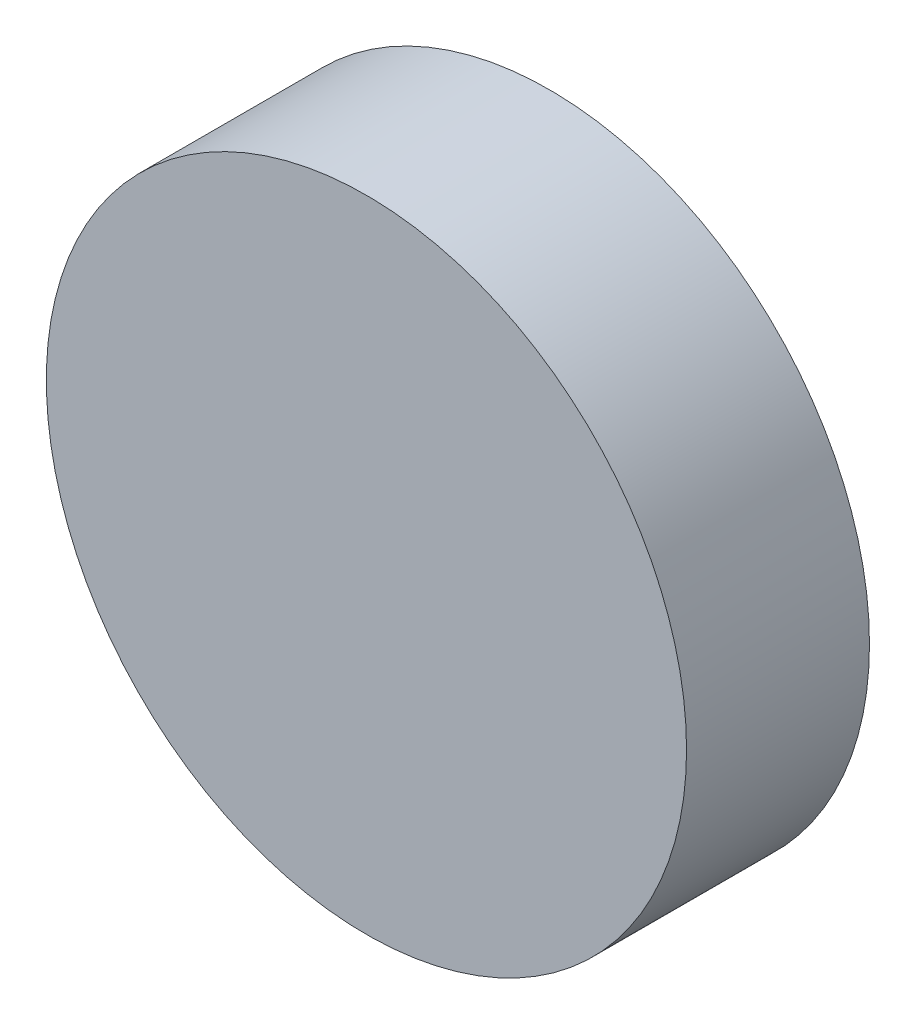
ISO-10303-21;
HEADER;
FILE_DESCRIPTION(('STEP AP214'),'2;1');
FILE_NAME('part.step','',(''),(''),'','','');
FILE_SCHEMA(('AUTOMOTIVE_DESIGN { 1 0 10303 214 1 1 1 1 }'));
ENDSEC;
DATA;
#1=APPLICATION_CONTEXT('core data for automotive mechanical design processes');
#2=APPLICATION_PROTOCOL_DEFINITION('international standard','automotive_design',2000,#1);
#3=PRODUCT_CONTEXT('',#1,'mechanical');
#4=PRODUCT('Part','Part','',(#3));
#5=PRODUCT_RELATED_PRODUCT_CATEGORY('part','',(#4));
#6=PRODUCT_DEFINITION_FORMATION('','',#4);
#7=PRODUCT_DEFINITION_CONTEXT('part definition',#1,'design');
#8=PRODUCT_DEFINITION('design','',#6,#7);
#9=PRODUCT_DEFINITION_SHAPE('','',#8);
#10=(LENGTH_UNIT() NAMED_UNIT(*) SI_UNIT(.MILLI.,.METRE.));
#11=(NAMED_UNIT(*) PLANE_ANGLE_UNIT() SI_UNIT($,.RADIAN.));
#12=(NAMED_UNIT(*) SI_UNIT($,.STERADIAN.) SOLID_ANGLE_UNIT());
#13=UNCERTAINTY_MEASURE_WITH_UNIT(LENGTH_MEASURE(1.E-05),#10,'distance_accuracy_value','');
#14=(GEOMETRIC_REPRESENTATION_CONTEXT(3) GLOBAL_UNCERTAINTY_ASSIGNED_CONTEXT((#13)) GLOBAL_UNIT_ASSIGNED_CONTEXT((#10,
#11,#12)) REPRESENTATION_CONTEXT('',''));
#15=CARTESIAN_POINT('',(0.,0.,0.));
#16=DIRECTION('',(0.,0.,1.));
#17=DIRECTION('',(1.,0.,0.));
#18=AXIS2_PLACEMENT_3D('',#15,#16,#17);
#19=CARTESIAN_POINT('',(0.,0.,10.));
#20=DIRECTION('',(0.,0.,-1.));
#21=DIRECTION('',(-1.,0.,0.));
#22=AXIS2_PLACEMENT_3D('',#19,#20,#21);
#23=CYLINDRICAL_SURFACE('',#22,17.5);
#24=CARTESIAN_POINT('',(0.,0.,10.));
#25=DIRECTION('',(0.,0.,1.));
#26=DIRECTION('',(1.,0.,0.));
#27=AXIS2_PLACEMENT_3D('',#24,#25,#26);
#28=CIRCLE('',#27,17.5);
#29=CARTESIAN_POINT('',(17.5,0.,10.));
#30=VERTEX_POINT('',#29);
#31=EDGE_CURVE('E10',#30,#30,#28,.T.);
#32=ORIENTED_EDGE('',*,*,#31,.F.);
#33=EDGE_LOOP('',(#32));
#34=FACE_BOUND('',#33,.T.);
#35=CARTESIAN_POINT('',(0.,0.,0.));
#36=DIRECTION('',(0.,0.,1.));
#37=DIRECTION('',(1.,0.,0.));
#38=AXIS2_PLACEMENT_3D('',#35,#36,#37);
#39=CIRCLE('',#38,17.5);
#40=CARTESIAN_POINT('',(17.5,0.,0.));
#41=VERTEX_POINT('',#40);
#42=EDGE_CURVE('E40',#41,#41,#39,.T.);
#43=ORIENTED_EDGE('',*,*,#42,.T.);
#44=EDGE_LOOP('',(#43));
#45=FACE_BOUND('',#44,.T.);
#46=ADVANCED_FACE('F37',(#34,#45),#23,.T.);
#47=CARTESIAN_POINT('',(0.,0.,10.));
#48=DIRECTION('',(0.,0.,1.));
#49=DIRECTION('',(1.,0.,0.));
#50=AXIS2_PLACEMENT_3D('',#47,#48,#49);
#51=PLANE('',#50);
#52=ORIENTED_EDGE('',*,*,#31,.T.);
#53=EDGE_LOOP('',(#52));
#54=FACE_BOUND('',#53,.T.);
#55=ADVANCED_FACE('F54',(#54),#51,.T.);
#56=CARTESIAN_POINT('',(0.,0.,0.));
#57=DIRECTION('',(0.,0.,1.));
#58=DIRECTION('',(1.,0.,0.));
#59=AXIS2_PLACEMENT_3D('',#56,#57,#58);
#60=PLANE('',#59);
#61=ORIENTED_EDGE('',*,*,#42,.F.);
#62=EDGE_LOOP('',(#61));
#63=FACE_BOUND('',#62,.T.);
#64=ADVANCED_FACE('F52',(#63),#60,.F.);
#65=CLOSED_SHELL('',(#46,#55,#64));
#66=MANIFOLD_SOLID_BREP('B2',#65);
#67=ADVANCED_BREP_SHAPE_REPRESENTATION('',(#18,#66),#14);
#68=SHAPE_DEFINITION_REPRESENTATION(#9,#67);
ENDSEC;
END-ISO-10303-21;
